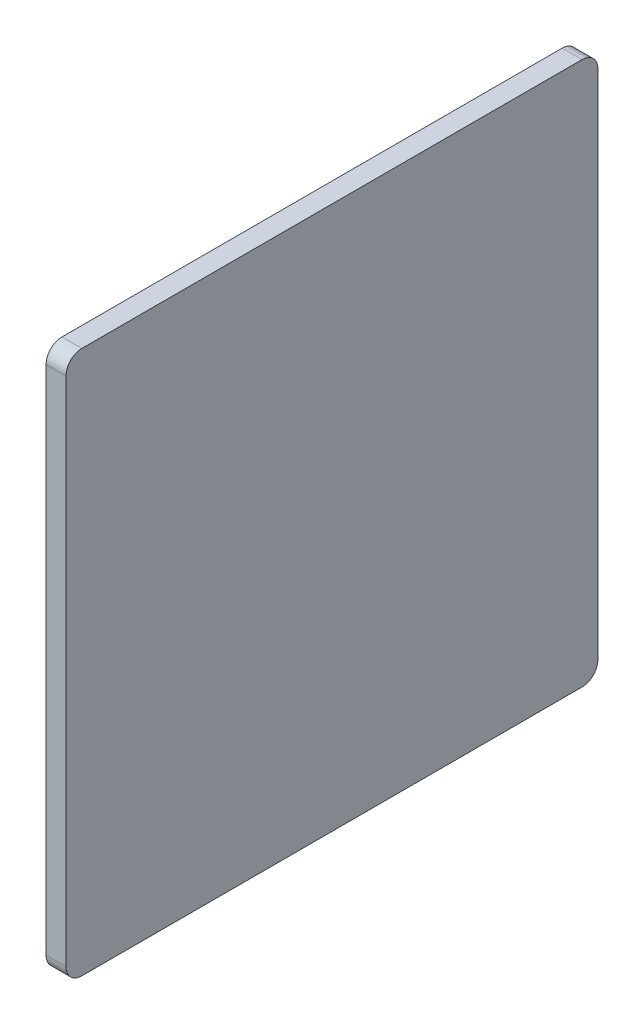
ISO-10303-21;
HEADER;
FILE_DESCRIPTION(('STEP AP214'),'2;1');
FILE_NAME('part.step','',(''),(''),'','','');
FILE_SCHEMA(('AUTOMOTIVE_DESIGN { 1 0 10303 214 1 1 1 1 }'));
ENDSEC;
DATA;
#1=APPLICATION_CONTEXT('core data for automotive mechanical design processes');
#2=APPLICATION_PROTOCOL_DEFINITION('international standard','automotive_design',2000,#1);
#3=PRODUCT_CONTEXT('',#1,'mechanical');
#4=PRODUCT('Part','Part','',(#3));
#5=PRODUCT_RELATED_PRODUCT_CATEGORY('part','',(#4));
#6=PRODUCT_DEFINITION_FORMATION('','',#4);
#7=PRODUCT_DEFINITION_CONTEXT('part definition',#1,'design');
#8=PRODUCT_DEFINITION('design','',#6,#7);
#9=PRODUCT_DEFINITION_SHAPE('','',#8);
#10=(LENGTH_UNIT() NAMED_UNIT(*) SI_UNIT(.MILLI.,.METRE.));
#11=(NAMED_UNIT(*) PLANE_ANGLE_UNIT() SI_UNIT($,.RADIAN.));
#12=(NAMED_UNIT(*) SI_UNIT($,.STERADIAN.) SOLID_ANGLE_UNIT());
#13=UNCERTAINTY_MEASURE_WITH_UNIT(LENGTH_MEASURE(1.E-05),#10,'distance_accuracy_value','');
#14=(GEOMETRIC_REPRESENTATION_CONTEXT(3) GLOBAL_UNCERTAINTY_ASSIGNED_CONTEXT((#13)) GLOBAL_UNIT_ASSIGNED_CONTEXT((#10,
#11,#12)) REPRESENTATION_CONTEXT('',''));
#15=CARTESIAN_POINT('',(0.,0.,0.));
#16=DIRECTION('',(0.,0.,1.));
#17=DIRECTION('',(1.,0.,0.));
#18=AXIS2_PLACEMENT_3D('',#15,#16,#17);
#19=CARTESIAN_POINT('',(3.175,-43.4125,42.499999963));
#20=DIRECTION('',(0.,0.,-1.));
#21=DIRECTION('',(-1.,0.,0.));
#22=AXIS2_PLACEMENT_3D('',#19,#20,#21);
#23=PLANE('',#22);
#24=DIRECTION('',(0.,-1.,0.));
#25=VECTOR('',#24,1.);
#26=CARTESIAN_POINT('',(0.,-43.4125,42.499999963));
#27=LINE('',#26,#25);
#28=CARTESIAN_POINT('',(0.,40.8725,42.499999963));
#29=VERTEX_POINT('',#28);
#30=CARTESIAN_POINT('',(0.,-40.8725,42.499999963));
#31=VERTEX_POINT('',#30);
#32=EDGE_CURVE('E133',#29,#31,#27,.T.);
#33=ORIENTED_EDGE('',*,*,#32,.T.);
#34=DIRECTION('',(-1.,0.,0.));
#35=VECTOR('',#34,1.);
#36=CARTESIAN_POINT('',(3.175,-40.8725,42.499999963));
#37=LINE('',#36,#35);
#38=CARTESIAN_POINT('',(3.175,-40.8725,42.499999963));
#39=VERTEX_POINT('',#38);
#40=EDGE_CURVE('E111',#31,#39,#37,.F.);
#41=ORIENTED_EDGE('',*,*,#40,.T.);
#42=DIRECTION('',(0.,-1.,0.));
#43=VECTOR('',#42,1.);
#44=CARTESIAN_POINT('',(3.175,-43.4125,42.499999963));
#45=LINE('',#44,#43);
#46=CARTESIAN_POINT('',(3.175,40.8725,42.499999963));
#47=VERTEX_POINT('',#46);
#48=EDGE_CURVE('E142',#47,#39,#45,.T.);
#49=ORIENTED_EDGE('',*,*,#48,.F.);
#50=DIRECTION('',(-1.,0.,0.));
#51=VECTOR('',#50,1.);
#52=CARTESIAN_POINT('',(3.175,40.8725,42.499999963));
#53=LINE('',#52,#51);
#54=EDGE_CURVE('E116',#47,#29,#53,.T.);
#55=ORIENTED_EDGE('',*,*,#54,.T.);
#56=EDGE_LOOP('',(#33,#41,#49,#55));
#57=FACE_BOUND('',#56,.T.);
#58=ADVANCED_FACE('F40',(#57),#23,.F.);
#59=CARTESIAN_POINT('',(3.175,-43.4125,-42.499999963));
#60=DIRECTION('',(0.,1.,0.));
#61=DIRECTION('',(0.,0.,1.));
#62=AXIS2_PLACEMENT_3D('',#59,#60,#61);
#63=PLANE('',#62);
#64=DIRECTION('',(0.,0.,-1.));
#65=VECTOR('',#64,1.);
#66=CARTESIAN_POINT('',(3.175,-43.4125,-42.499999963));
#67=LINE('',#66,#65);
#68=CARTESIAN_POINT('',(3.175,-43.4125,39.959999963));
#69=VERTEX_POINT('',#68);
#70=CARTESIAN_POINT('',(3.175,-43.4125,-39.959999963));
#71=VERTEX_POINT('',#70);
#72=EDGE_CURVE('E126',#69,#71,#67,.T.);
#73=ORIENTED_EDGE('',*,*,#72,.F.);
#74=DIRECTION('',(-1.,0.,0.));
#75=VECTOR('',#74,1.);
#76=CARTESIAN_POINT('',(3.175,-43.4125,39.959999963));
#77=LINE('',#76,#75);
#78=CARTESIAN_POINT('',(0.,-43.4125,39.959999963));
#79=VERTEX_POINT('',#78);
#80=EDGE_CURVE('E110',#69,#79,#77,.T.);
#81=ORIENTED_EDGE('',*,*,#80,.T.);
#82=DIRECTION('',(0.,0.,-1.));
#83=VECTOR('',#82,1.);
#84=CARTESIAN_POINT('',(0.,-43.4125,-42.499999963));
#85=LINE('',#84,#83);
#86=CARTESIAN_POINT('',(0.,-43.4125,-39.959999963));
#87=VERTEX_POINT('',#86);
#88=EDGE_CURVE('E123',#79,#87,#85,.T.);
#89=ORIENTED_EDGE('',*,*,#88,.T.);
#90=DIRECTION('',(-1.,0.,0.));
#91=VECTOR('',#90,1.);
#92=CARTESIAN_POINT('',(3.175,-43.4125,-39.959999963));
#93=LINE('',#92,#91);
#94=EDGE_CURVE('E128',#87,#71,#93,.F.);
#95=ORIENTED_EDGE('',*,*,#94,.T.);
#96=EDGE_LOOP('',(#73,#81,#89,#95));
#97=FACE_BOUND('',#96,.T.);
#98=ADVANCED_FACE('F122',(#97),#63,.F.);
#99=CARTESIAN_POINT('',(3.175,-43.4125,-42.499999963));
#100=DIRECTION('',(0.,0.,1.));
#101=DIRECTION('',(1.,0.,0.));
#102=AXIS2_PLACEMENT_3D('',#99,#100,#101);
#103=PLANE('',#102);
#104=DIRECTION('',(0.,1.,0.));
#105=VECTOR('',#104,1.);
#106=CARTESIAN_POINT('',(3.175,-43.4125,-42.499999963));
#107=LINE('',#106,#105);
#108=CARTESIAN_POINT('',(3.175,-40.8725,-42.499999963));
#109=VERTEX_POINT('',#108);
#110=CARTESIAN_POINT('',(3.175,40.8725,-42.499999963));
#111=VERTEX_POINT('',#110);
#112=EDGE_CURVE('E168',#109,#111,#107,.T.);
#113=ORIENTED_EDGE('',*,*,#112,.F.);
#114=DIRECTION('',(-1.,0.,0.));
#115=VECTOR('',#114,1.);
#116=CARTESIAN_POINT('',(3.175,-40.8725,-42.499999963));
#117=LINE('',#116,#115);
#118=CARTESIAN_POINT('',(0.,-40.8725,-42.499999963));
#119=VERTEX_POINT('',#118);
#120=EDGE_CURVE('E161',#109,#119,#117,.T.);
#121=ORIENTED_EDGE('',*,*,#120,.T.);
#122=DIRECTION('',(0.,1.,0.));
#123=VECTOR('',#122,1.);
#124=CARTESIAN_POINT('',(0.,-43.4125,-42.499999963));
#125=LINE('',#124,#123);
#126=CARTESIAN_POINT('',(0.,40.8725,-42.499999963));
#127=VERTEX_POINT('',#126);
#128=EDGE_CURVE('E132',#119,#127,#125,.T.);
#129=ORIENTED_EDGE('',*,*,#128,.T.);
#130=DIRECTION('',(-1.,0.,0.));
#131=VECTOR('',#130,1.);
#132=CARTESIAN_POINT('',(3.175,40.8725,-42.499999963));
#133=LINE('',#132,#131);
#134=EDGE_CURVE('E159',#127,#111,#133,.F.);
#135=ORIENTED_EDGE('',*,*,#134,.T.);
#136=EDGE_LOOP('',(#113,#121,#129,#135));
#137=FACE_BOUND('',#136,.T.);
#138=ADVANCED_FACE('F166',(#137),#103,.F.);
#139=CARTESIAN_POINT('',(3.175,43.4125,-42.499999963));
#140=DIRECTION('',(0.,-1.,0.));
#141=DIRECTION('',(0.,0.,-1.));
#142=AXIS2_PLACEMENT_3D('',#139,#140,#141);
#143=PLANE('',#142);
#144=DIRECTION('',(0.,0.,1.));
#145=VECTOR('',#144,1.);
#146=CARTESIAN_POINT('',(3.175,43.4125,-42.499999963));
#147=LINE('',#146,#145);
#148=CARTESIAN_POINT('',(3.175,43.4125,-39.959999963));
#149=VERTEX_POINT('',#148);
#150=CARTESIAN_POINT('',(3.175,43.4125,39.959999963));
#151=VERTEX_POINT('',#150);
#152=EDGE_CURVE('E143',#149,#151,#147,.T.);
#153=ORIENTED_EDGE('',*,*,#152,.F.);
#154=DIRECTION('',(-1.,0.,0.));
#155=VECTOR('',#154,1.);
#156=CARTESIAN_POINT('',(3.175,43.4125,-39.959999963));
#157=LINE('',#156,#155);
#158=CARTESIAN_POINT('',(0.,43.4125,-39.959999963));
#159=VERTEX_POINT('',#158);
#160=EDGE_CURVE('E11',#149,#159,#157,.T.);
#161=ORIENTED_EDGE('',*,*,#160,.T.);
#162=DIRECTION('',(0.,0.,1.));
#163=VECTOR('',#162,1.);
#164=CARTESIAN_POINT('',(0.,43.4125,-42.499999963));
#165=LINE('',#164,#163);
#166=CARTESIAN_POINT('',(0.,43.4125,39.959999963));
#167=VERTEX_POINT('',#166);
#168=EDGE_CURVE('E136',#159,#167,#165,.T.);
#169=ORIENTED_EDGE('',*,*,#168,.T.);
#170=DIRECTION('',(-1.,0.,0.));
#171=VECTOR('',#170,1.);
#172=CARTESIAN_POINT('',(3.175,43.4125,39.959999963));
#173=LINE('',#172,#171);
#174=EDGE_CURVE('E48',#167,#151,#173,.F.);
#175=ORIENTED_EDGE('',*,*,#174,.T.);
#176=EDGE_LOOP('',(#153,#161,#169,#175));
#177=FACE_BOUND('',#176,.T.);
#178=ADVANCED_FACE('F175',(#177),#143,.F.);
#179=CARTESIAN_POINT('',(3.175,0.,0.));
#180=DIRECTION('',(1.,0.,0.));
#181=DIRECTION('',(0.,0.,-1.));
#182=AXIS2_PLACEMENT_3D('',#179,#180,#181);
#183=PLANE('',#182);
#184=ORIENTED_EDGE('',*,*,#48,.T.);
#185=CARTESIAN_POINT('',(3.175,-40.8725,39.959999963));
#186=DIRECTION('',(1.,0.,0.));
#187=DIRECTION('',(0.,0.,-1.));
#188=AXIS2_PLACEMENT_3D('',#185,#186,#187);
#189=CIRCLE('',#188,2.54);
#190=EDGE_CURVE('E157',#39,#69,#189,.T.);
#191=ORIENTED_EDGE('',*,*,#190,.T.);
#192=ORIENTED_EDGE('',*,*,#72,.T.);
#193=CARTESIAN_POINT('',(3.175,-40.8725,-39.959999963));
#194=DIRECTION('',(1.,0.,0.));
#195=DIRECTION('',(0.,0.,-1.));
#196=AXIS2_PLACEMENT_3D('',#193,#194,#195);
#197=CIRCLE('',#196,2.54);
#198=EDGE_CURVE('E155',#71,#109,#197,.T.);
#199=ORIENTED_EDGE('',*,*,#198,.T.);
#200=ORIENTED_EDGE('',*,*,#112,.T.);
#201=CARTESIAN_POINT('',(3.175,40.8725,-39.959999963));
#202=DIRECTION('',(1.,0.,0.));
#203=DIRECTION('',(0.,0.,-1.));
#204=AXIS2_PLACEMENT_3D('',#201,#202,#203);
#205=CIRCLE('',#204,2.54);
#206=EDGE_CURVE('E61',#111,#149,#205,.T.);
#207=ORIENTED_EDGE('',*,*,#206,.T.);
#208=ORIENTED_EDGE('',*,*,#152,.T.);
#209=CARTESIAN_POINT('',(3.175,40.8725,39.959999963));
#210=DIRECTION('',(1.,0.,0.));
#211=DIRECTION('',(0.,0.,-1.));
#212=AXIS2_PLACEMENT_3D('',#209,#210,#211);
#213=CIRCLE('',#212,2.54);
#214=EDGE_CURVE('E152',#151,#47,#213,.T.);
#215=ORIENTED_EDGE('',*,*,#214,.T.);
#216=EDGE_LOOP('',(#184,#191,#192,#199,#200,#207,#208,#215));
#217=FACE_BOUND('',#216,.T.);
#218=ADVANCED_FACE('F182',(#217),#183,.T.);
#219=CARTESIAN_POINT('',(0.,0.,0.));
#220=DIRECTION('',(1.,0.,0.));
#221=DIRECTION('',(0.,0.,-1.));
#222=AXIS2_PLACEMENT_3D('',#219,#220,#221);
#223=PLANE('',#222);
#224=ORIENTED_EDGE('',*,*,#88,.F.);
#225=CARTESIAN_POINT('',(0.,-40.8725,39.959999963));
#226=DIRECTION('',(1.,0.,0.));
#227=DIRECTION('',(0.,0.,-1.));
#228=AXIS2_PLACEMENT_3D('',#225,#226,#227);
#229=CIRCLE('',#228,2.54);
#230=EDGE_CURVE('E106',#79,#31,#229,.F.);
#231=ORIENTED_EDGE('',*,*,#230,.T.);
#232=ORIENTED_EDGE('',*,*,#32,.F.);
#233=CARTESIAN_POINT('',(0.,40.8725,39.959999963));
#234=DIRECTION('',(1.,0.,0.));
#235=DIRECTION('',(0.,0.,-1.));
#236=AXIS2_PLACEMENT_3D('',#233,#234,#235);
#237=CIRCLE('',#236,2.54);
#238=EDGE_CURVE('E127',#29,#167,#237,.F.);
#239=ORIENTED_EDGE('',*,*,#238,.T.);
#240=ORIENTED_EDGE('',*,*,#168,.F.);
#241=CARTESIAN_POINT('',(0.,40.8725,-39.959999963));
#242=DIRECTION('',(1.,0.,0.));
#243=DIRECTION('',(0.,0.,-1.));
#244=AXIS2_PLACEMENT_3D('',#241,#242,#243);
#245=CIRCLE('',#244,2.54);
#246=EDGE_CURVE('E146',#159,#127,#245,.F.);
#247=ORIENTED_EDGE('',*,*,#246,.T.);
#248=ORIENTED_EDGE('',*,*,#128,.F.);
#249=CARTESIAN_POINT('',(0.,-40.8725,-39.959999963));
#250=DIRECTION('',(1.,0.,0.));
#251=DIRECTION('',(0.,0.,-1.));
#252=AXIS2_PLACEMENT_3D('',#249,#250,#251);
#253=CIRCLE('',#252,2.54);
#254=EDGE_CURVE('E117',#119,#87,#253,.F.);
#255=ORIENTED_EDGE('',*,*,#254,.T.);
#256=EDGE_LOOP('',(#224,#231,#232,#239,#240,#247,#248,#255));
#257=FACE_BOUND('',#256,.T.);
#258=ADVANCED_FACE('F130',(#257),#223,.F.);
#259=CARTESIAN_POINT('',(3.175,-40.8725,39.959999963));
#260=DIRECTION('',(-1.,0.,0.));
#261=DIRECTION('',(0.,0.,1.));
#262=AXIS2_PLACEMENT_3D('',#259,#260,#261);
#263=CYLINDRICAL_SURFACE('',#262,2.54);
#264=ORIENTED_EDGE('',*,*,#190,.F.);
#265=ORIENTED_EDGE('',*,*,#40,.F.);
#266=ORIENTED_EDGE('',*,*,#230,.F.);
#267=ORIENTED_EDGE('',*,*,#80,.F.);
#268=EDGE_LOOP('',(#264,#265,#266,#267));
#269=FACE_BOUND('',#268,.T.);
#270=ADVANCED_FACE('F109',(#269),#263,.T.);
#271=CARTESIAN_POINT('',(3.175,-40.8725,-39.959999963));
#272=DIRECTION('',(-1.,0.,0.));
#273=DIRECTION('',(0.,0.,1.));
#274=AXIS2_PLACEMENT_3D('',#271,#272,#273);
#275=CYLINDRICAL_SURFACE('',#274,2.54);
#276=ORIENTED_EDGE('',*,*,#198,.F.);
#277=ORIENTED_EDGE('',*,*,#94,.F.);
#278=ORIENTED_EDGE('',*,*,#254,.F.);
#279=ORIENTED_EDGE('',*,*,#120,.F.);
#280=EDGE_LOOP('',(#276,#277,#278,#279));
#281=FACE_BOUND('',#280,.T.);
#282=ADVANCED_FACE('F190',(#281),#275,.T.);
#283=CARTESIAN_POINT('',(3.175,40.8725,-39.959999963));
#284=DIRECTION('',(-1.,0.,0.));
#285=DIRECTION('',(0.,0.,1.));
#286=AXIS2_PLACEMENT_3D('',#283,#284,#285);
#287=CYLINDRICAL_SURFACE('',#286,2.54);
#288=ORIENTED_EDGE('',*,*,#206,.F.);
#289=ORIENTED_EDGE('',*,*,#134,.F.);
#290=ORIENTED_EDGE('',*,*,#246,.F.);
#291=ORIENTED_EDGE('',*,*,#160,.F.);
#292=EDGE_LOOP('',(#288,#289,#290,#291));
#293=FACE_BOUND('',#292,.T.);
#294=ADVANCED_FACE('F174',(#293),#287,.T.);
#295=CARTESIAN_POINT('',(3.175,40.8725,39.959999963));
#296=DIRECTION('',(-1.,0.,0.));
#297=DIRECTION('',(0.,0.,1.));
#298=AXIS2_PLACEMENT_3D('',#295,#296,#297);
#299=CYLINDRICAL_SURFACE('',#298,2.54);
#300=ORIENTED_EDGE('',*,*,#214,.F.);
#301=ORIENTED_EDGE('',*,*,#174,.F.);
#302=ORIENTED_EDGE('',*,*,#238,.F.);
#303=ORIENTED_EDGE('',*,*,#54,.F.);
#304=EDGE_LOOP('',(#300,#301,#302,#303));
#305=FACE_BOUND('',#304,.T.);
#306=ADVANCED_FACE('F42',(#305),#299,.T.);
#307=CLOSED_SHELL('',(#58,#98,#138,#178,#218,#258,#270,#282,#294,#306));
#308=MANIFOLD_SOLID_BREP('B2',#307);
#309=ADVANCED_BREP_SHAPE_REPRESENTATION('',(#18,#308),#14);
#310=SHAPE_DEFINITION_REPRESENTATION(#9,#309);
ENDSEC;
END-ISO-10303-21;
